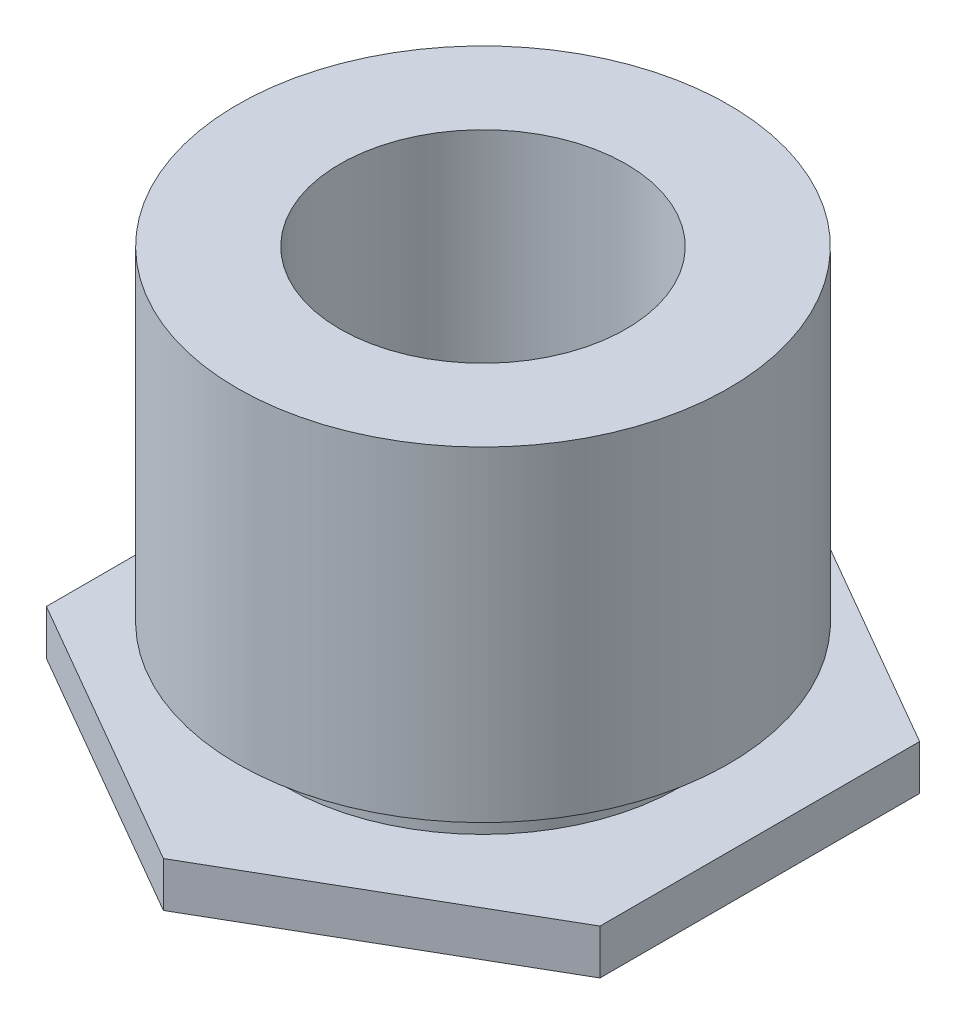
ISO-10303-21;
HEADER;
FILE_DESCRIPTION(('STEP AP214'),'2;1');
FILE_NAME('part.step','',(''),(''),'','','');
FILE_SCHEMA(('AUTOMOTIVE_DESIGN { 1 0 10303 214 1 1 1 1 }'));
ENDSEC;
DATA;
#1=APPLICATION_CONTEXT('core data for automotive mechanical design processes');
#2=APPLICATION_PROTOCOL_DEFINITION('international standard','automotive_design',2000,#1);
#3=PRODUCT_CONTEXT('',#1,'mechanical');
#4=PRODUCT('Part','Part','',(#3));
#5=PRODUCT_RELATED_PRODUCT_CATEGORY('part','',(#4));
#6=PRODUCT_DEFINITION_FORMATION('','',#4);
#7=PRODUCT_DEFINITION_CONTEXT('part definition',#1,'design');
#8=PRODUCT_DEFINITION('design','',#6,#7);
#9=PRODUCT_DEFINITION_SHAPE('','',#8);
#10=(LENGTH_UNIT() NAMED_UNIT(*) SI_UNIT(.MILLI.,.METRE.));
#11=(NAMED_UNIT(*) PLANE_ANGLE_UNIT() SI_UNIT($,.RADIAN.));
#12=(NAMED_UNIT(*) SI_UNIT($,.STERADIAN.) SOLID_ANGLE_UNIT());
#13=UNCERTAINTY_MEASURE_WITH_UNIT(LENGTH_MEASURE(1.E-05),#10,'distance_accuracy_value','');
#14=(GEOMETRIC_REPRESENTATION_CONTEXT(3) GLOBAL_UNCERTAINTY_ASSIGNED_CONTEXT((#13)) GLOBAL_UNIT_ASSIGNED_CONTEXT((#10,
#11,#12)) REPRESENTATION_CONTEXT('',''));
#15=CARTESIAN_POINT('',(0.,0.,0.));
#16=DIRECTION('',(0.,0.,1.));
#17=DIRECTION('',(1.,0.,0.));
#18=AXIS2_PLACEMENT_3D('',#15,#16,#17);
#19=CARTESIAN_POINT('',(-4.,0.65,2.3094010767585));
#20=DIRECTION('',(0.5,0.,-0.866025403784439));
#21=DIRECTION('',(-0.866025403784439,0.,-0.5));
#22=AXIS2_PLACEMENT_3D('',#19,#20,#21);
#23=PLANE('',#22);
#24=DIRECTION('',(0.866025403784438,0.,0.5));
#25=VECTOR('',#24,1.);
#26=CARTESIAN_POINT('',(-4.,0.,2.3094010767585));
#27=LINE('',#26,#25);
#28=CARTESIAN_POINT('',(-4.,0.,2.3094010767585));
#29=VERTEX_POINT('',#28);
#30=CARTESIAN_POINT('',(0.,0.,4.61880215351701));
#31=VERTEX_POINT('',#30);
#32=EDGE_CURVE('E122',#29,#31,#27,.T.);
#33=ORIENTED_EDGE('',*,*,#32,.T.);
#34=DIRECTION('',(0.,-1.,0.));
#35=VECTOR('',#34,1.);
#36=CARTESIAN_POINT('',(0.,0.65,4.61880215351701));
#37=LINE('',#36,#35);
#38=CARTESIAN_POINT('',(0.,0.65,4.61880215351701));
#39=VERTEX_POINT('',#38);
#40=EDGE_CURVE('E39',#39,#31,#37,.T.);
#41=ORIENTED_EDGE('',*,*,#40,.F.);
#42=DIRECTION('',(0.866025403784438,0.,0.5));
#43=VECTOR('',#42,1.);
#44=CARTESIAN_POINT('',(-4.,0.65,2.3094010767585));
#45=LINE('',#44,#43);
#46=CARTESIAN_POINT('',(-4.,0.65,2.3094010767585));
#47=VERTEX_POINT('',#46);
#48=EDGE_CURVE('E133',#47,#39,#45,.T.);
#49=ORIENTED_EDGE('',*,*,#48,.F.);
#50=DIRECTION('',(0.,-1.,0.));
#51=VECTOR('',#50,1.);
#52=CARTESIAN_POINT('',(-4.,0.65,2.3094010767585));
#53=LINE('',#52,#51);
#54=EDGE_CURVE('E118',#47,#29,#53,.T.);
#55=ORIENTED_EDGE('',*,*,#54,.T.);
#56=EDGE_LOOP('',(#33,#41,#49,#55));
#57=FACE_BOUND('',#56,.T.);
#58=ADVANCED_FACE('F36',(#57),#23,.F.);
#59=CARTESIAN_POINT('',(0.,0.65,4.61880215351701));
#60=DIRECTION('',(-0.5,0.,-0.866025403784439));
#61=DIRECTION('',(-0.866025403784439,0.,0.5));
#62=AXIS2_PLACEMENT_3D('',#59,#60,#61);
#63=PLANE('',#62);
#64=DIRECTION('',(0.866025403784439,0.,-0.5));
#65=VECTOR('',#64,1.);
#66=CARTESIAN_POINT('',(0.,0.,4.61880215351701));
#67=LINE('',#66,#65);
#68=CARTESIAN_POINT('',(4.,0.,2.3094010767585));
#69=VERTEX_POINT('',#68);
#70=EDGE_CURVE('E125',#31,#69,#67,.T.);
#71=ORIENTED_EDGE('',*,*,#70,.T.);
#72=DIRECTION('',(0.,-1.,0.));
#73=VECTOR('',#72,1.);
#74=CARTESIAN_POINT('',(4.,0.65,2.3094010767585));
#75=LINE('',#74,#73);
#76=CARTESIAN_POINT('',(4.,0.65,2.3094010767585));
#77=VERTEX_POINT('',#76);
#78=EDGE_CURVE('E136',#77,#69,#75,.T.);
#79=ORIENTED_EDGE('',*,*,#78,.F.);
#80=DIRECTION('',(0.866025403784439,0.,-0.5));
#81=VECTOR('',#80,1.);
#82=CARTESIAN_POINT('',(0.,0.65,4.61880215351701));
#83=LINE('',#82,#81);
#84=EDGE_CURVE('E91',#39,#77,#83,.T.);
#85=ORIENTED_EDGE('',*,*,#84,.F.);
#86=ORIENTED_EDGE('',*,*,#40,.T.);
#87=EDGE_LOOP('',(#71,#79,#85,#86));
#88=FACE_BOUND('',#87,.T.);
#89=ADVANCED_FACE('F141',(#88),#63,.F.);
#90=CARTESIAN_POINT('',(4.,0.65,2.3094010767585));
#91=DIRECTION('',(-1.,0.,0.));
#92=DIRECTION('',(0.,0.,1.));
#93=AXIS2_PLACEMENT_3D('',#90,#91,#92);
#94=PLANE('',#93);
#95=DIRECTION('',(0.,0.,-1.));
#96=VECTOR('',#95,1.);
#97=CARTESIAN_POINT('',(4.,0.,2.3094010767585));
#98=LINE('',#97,#96);
#99=CARTESIAN_POINT('',(4.,0.,-2.3094010767585));
#100=VERTEX_POINT('',#99);
#101=EDGE_CURVE('E128',#69,#100,#98,.T.);
#102=ORIENTED_EDGE('',*,*,#101,.T.);
#103=DIRECTION('',(0.,-1.,0.));
#104=VECTOR('',#103,1.);
#105=CARTESIAN_POINT('',(4.,0.65,-2.3094010767585));
#106=LINE('',#105,#104);
#107=CARTESIAN_POINT('',(4.,0.65,-2.3094010767585));
#108=VERTEX_POINT('',#107);
#109=EDGE_CURVE('E113',#108,#100,#106,.T.);
#110=ORIENTED_EDGE('',*,*,#109,.F.);
#111=DIRECTION('',(0.,0.,-1.));
#112=VECTOR('',#111,1.);
#113=CARTESIAN_POINT('',(4.,0.65,2.3094010767585));
#114=LINE('',#113,#112);
#115=EDGE_CURVE('E104',#77,#108,#114,.T.);
#116=ORIENTED_EDGE('',*,*,#115,.F.);
#117=ORIENTED_EDGE('',*,*,#78,.T.);
#118=EDGE_LOOP('',(#102,#110,#116,#117));
#119=FACE_BOUND('',#118,.T.);
#120=ADVANCED_FACE('F147',(#119),#94,.F.);
#121=CARTESIAN_POINT('',(4.,0.65,-2.3094010767585));
#122=DIRECTION('',(-0.5,0.,0.866025403784439));
#123=DIRECTION('',(0.866025403784439,0.,0.5));
#124=AXIS2_PLACEMENT_3D('',#121,#122,#123);
#125=PLANE('',#124);
#126=DIRECTION('',(-0.866025403784439,0.,-0.5));
#127=VECTOR('',#126,1.);
#128=CARTESIAN_POINT('',(4.,0.,-2.3094010767585));
#129=LINE('',#128,#127);
#130=CARTESIAN_POINT('',(0.,0.,-4.61880215351701));
#131=VERTEX_POINT('',#130);
#132=EDGE_CURVE('E112',#100,#131,#129,.T.);
#133=ORIENTED_EDGE('',*,*,#132,.T.);
#134=DIRECTION('',(0.,-1.,0.));
#135=VECTOR('',#134,1.);
#136=CARTESIAN_POINT('',(0.,0.65,-4.61880215351701));
#137=LINE('',#136,#135);
#138=CARTESIAN_POINT('',(0.,0.65,-4.61880215351701));
#139=VERTEX_POINT('',#138);
#140=EDGE_CURVE('E109',#139,#131,#137,.T.);
#141=ORIENTED_EDGE('',*,*,#140,.F.);
#142=DIRECTION('',(-0.866025403784439,0.,-0.5));
#143=VECTOR('',#142,1.);
#144=CARTESIAN_POINT('',(4.,0.65,-2.3094010767585));
#145=LINE('',#144,#143);
#146=EDGE_CURVE('E98',#108,#139,#145,.T.);
#147=ORIENTED_EDGE('',*,*,#146,.F.);
#148=ORIENTED_EDGE('',*,*,#109,.T.);
#149=EDGE_LOOP('',(#133,#141,#147,#148));
#150=FACE_BOUND('',#149,.T.);
#151=ADVANCED_FACE('F110',(#150),#125,.F.);
#152=CARTESIAN_POINT('',(0.,0.65,-4.61880215351701));
#153=DIRECTION('',(0.5,0.,0.866025403784439));
#154=DIRECTION('',(0.866025403784439,0.,-0.5));
#155=AXIS2_PLACEMENT_3D('',#152,#153,#154);
#156=PLANE('',#155);
#157=DIRECTION('',(-0.866025403784439,0.,0.5));
#158=VECTOR('',#157,1.);
#159=CARTESIAN_POINT('',(0.,0.,-4.61880215351701));
#160=LINE('',#159,#158);
#161=CARTESIAN_POINT('',(-4.,0.,-2.3094010767585));
#162=VERTEX_POINT('',#161);
#163=EDGE_CURVE('E76',#131,#162,#160,.T.);
#164=ORIENTED_EDGE('',*,*,#163,.T.);
#165=DIRECTION('',(0.,-1.,0.));
#166=VECTOR('',#165,1.);
#167=CARTESIAN_POINT('',(-4.,0.65,-2.3094010767585));
#168=LINE('',#167,#166);
#169=CARTESIAN_POINT('',(-4.,0.65,-2.3094010767585));
#170=VERTEX_POINT('',#169);
#171=EDGE_CURVE('E114',#170,#162,#168,.T.);
#172=ORIENTED_EDGE('',*,*,#171,.F.);
#173=DIRECTION('',(-0.866025403784439,0.,0.5));
#174=VECTOR('',#173,1.);
#175=CARTESIAN_POINT('',(0.,0.65,-4.61880215351701));
#176=LINE('',#175,#174);
#177=EDGE_CURVE('E102',#139,#170,#176,.T.);
#178=ORIENTED_EDGE('',*,*,#177,.F.);
#179=ORIENTED_EDGE('',*,*,#140,.T.);
#180=EDGE_LOOP('',(#164,#172,#178,#179));
#181=FACE_BOUND('',#180,.T.);
#182=ADVANCED_FACE('F116',(#181),#156,.F.);
#183=CARTESIAN_POINT('',(-4.,0.65,-2.3094010767585));
#184=DIRECTION('',(1.,0.,0.));
#185=DIRECTION('',(0.,0.,-1.));
#186=AXIS2_PLACEMENT_3D('',#183,#184,#185);
#187=PLANE('',#186);
#188=DIRECTION('',(0.,0.,1.));
#189=VECTOR('',#188,1.);
#190=CARTESIAN_POINT('',(-4.,0.,-2.3094010767585));
#191=LINE('',#190,#189);
#192=EDGE_CURVE('E82',#162,#29,#191,.T.);
#193=ORIENTED_EDGE('',*,*,#192,.T.);
#194=ORIENTED_EDGE('',*,*,#54,.F.);
#195=DIRECTION('',(0.,0.,1.));
#196=VECTOR('',#195,1.);
#197=CARTESIAN_POINT('',(-4.,0.65,-2.3094010767585));
#198=LINE('',#197,#196);
#199=EDGE_CURVE('E53',#170,#47,#198,.T.);
#200=ORIENTED_EDGE('',*,*,#199,.F.);
#201=ORIENTED_EDGE('',*,*,#171,.T.);
#202=EDGE_LOOP('',(#193,#194,#200,#201));
#203=FACE_BOUND('',#202,.T.);
#204=ADVANCED_FACE('F194',(#203),#187,.F.);
#205=CARTESIAN_POINT('',(0.,0.65,0.));
#206=DIRECTION('',(0.,1.,0.));
#207=DIRECTION('',(0.,0.,1.));
#208=AXIS2_PLACEMENT_3D('',#205,#206,#207);
#209=PLANE('',#208);
#210=CARTESIAN_POINT('',(0.,0.65,0.));
#211=DIRECTION('',(0.,1.,0.));
#212=DIRECTION('',(0.,0.,1.));
#213=AXIS2_PLACEMENT_3D('',#210,#211,#212);
#214=CIRCLE('',#213,2.84);
#215=CARTESIAN_POINT('',(0.,0.65,2.84));
#216=VERTEX_POINT('',#215);
#217=EDGE_CURVE('E11',#216,#216,#214,.T.);
#218=ORIENTED_EDGE('',*,*,#217,.F.);
#219=EDGE_LOOP('',(#218));
#220=FACE_BOUND('',#219,.T.);
#221=ORIENTED_EDGE('',*,*,#48,.T.);
#222=ORIENTED_EDGE('',*,*,#84,.T.);
#223=ORIENTED_EDGE('',*,*,#115,.T.);
#224=ORIENTED_EDGE('',*,*,#146,.T.);
#225=ORIENTED_EDGE('',*,*,#177,.T.);
#226=ORIENTED_EDGE('',*,*,#199,.T.);
#227=EDGE_LOOP('',(#221,#222,#223,#224,#225,#226));
#228=FACE_BOUND('',#227,.T.);
#229=ADVANCED_FACE('F100',(#220,#228),#209,.T.);
#230=CARTESIAN_POINT('',(0.,0.,0.));
#231=DIRECTION('',(0.,1.,0.));
#232=DIRECTION('',(0.,0.,1.));
#233=AXIS2_PLACEMENT_3D('',#230,#231,#232);
#234=PLANE('',#233);
#235=ORIENTED_EDGE('',*,*,#32,.F.);
#236=ORIENTED_EDGE('',*,*,#192,.F.);
#237=ORIENTED_EDGE('',*,*,#163,.F.);
#238=ORIENTED_EDGE('',*,*,#132,.F.);
#239=ORIENTED_EDGE('',*,*,#101,.F.);
#240=ORIENTED_EDGE('',*,*,#70,.F.);
#241=EDGE_LOOP('',(#235,#236,#237,#238,#239,#240));
#242=FACE_BOUND('',#241,.T.);
#243=ADVANCED_FACE('F146',(#242),#234,.F.);
#244=CARTESIAN_POINT('',(2.067,6.,0.));
#245=DIRECTION('',(0.,-1.,0.));
#246=DIRECTION('',(0.,0.,-1.));
#247=AXIS2_PLACEMENT_3D('',#244,#245,#246);
#248=PLANE('',#247);
#249=CARTESIAN_POINT('',(0.,6.,0.));
#250=DIRECTION('',(0.,1.,0.));
#251=DIRECTION('',(0.,0.,1.));
#252=AXIS2_PLACEMENT_3D('',#249,#250,#251);
#253=CIRCLE('',#252,2.067);
#254=CARTESIAN_POINT('',(0.,6.,2.067));
#255=VERTEX_POINT('',#254);
#256=EDGE_CURVE('E162',#255,#255,#253,.T.);
#257=ORIENTED_EDGE('',*,*,#256,.F.);
#258=EDGE_LOOP('',(#257));
#259=FACE_BOUND('',#258,.T.);
#260=CARTESIAN_POINT('',(0.,6.,0.));
#261=DIRECTION('',(0.,1.,0.));
#262=DIRECTION('',(0.,0.,1.));
#263=AXIS2_PLACEMENT_3D('',#260,#261,#262);
#264=CIRCLE('',#263,3.55);
#265=CARTESIAN_POINT('',(0.,6.,3.55));
#266=VERTEX_POINT('',#265);
#267=EDGE_CURVE('E126',#266,#266,#264,.T.);
#268=ORIENTED_EDGE('',*,*,#267,.T.);
#269=EDGE_LOOP('',(#268));
#270=FACE_BOUND('',#269,.T.);
#271=ADVANCED_FACE('F168',(#259,#270),#248,.F.);
#272=CARTESIAN_POINT('',(0.,2.8,0.));
#273=DIRECTION('',(0.,1.,0.));
#274=DIRECTION('',(0.,0.,1.));
#275=AXIS2_PLACEMENT_3D('',#272,#273,#274);
#276=CYLINDRICAL_SURFACE('',#275,3.55);
#277=ORIENTED_EDGE('',*,*,#267,.F.);
#278=EDGE_LOOP('',(#277));
#279=FACE_BOUND('',#278,.T.);
#280=CARTESIAN_POINT('',(0.,1.3,0.));
#281=DIRECTION('',(0.,1.,0.));
#282=DIRECTION('',(0.,0.,1.));
#283=AXIS2_PLACEMENT_3D('',#280,#281,#282);
#284=CIRCLE('',#283,3.55);
#285=CARTESIAN_POINT('',(0.,1.3,3.55));
#286=VERTEX_POINT('',#285);
#287=EDGE_CURVE('E153',#286,#286,#284,.T.);
#288=ORIENTED_EDGE('',*,*,#287,.T.);
#289=EDGE_LOOP('',(#288));
#290=FACE_BOUND('',#289,.T.);
#291=ADVANCED_FACE('F171',(#279,#290),#276,.T.);
#292=CARTESIAN_POINT('',(3.55,1.3,0.));
#293=DIRECTION('',(0.,1.,0.));
#294=DIRECTION('',(0.,0.,1.));
#295=AXIS2_PLACEMENT_3D('',#292,#293,#294);
#296=PLANE('',#295);
#297=ORIENTED_EDGE('',*,*,#287,.F.);
#298=EDGE_LOOP('',(#297));
#299=FACE_BOUND('',#298,.T.);
#300=CARTESIAN_POINT('',(0.,1.3,0.));
#301=DIRECTION('',(0.,1.,0.));
#302=DIRECTION('',(0.,0.,1.));
#303=AXIS2_PLACEMENT_3D('',#300,#301,#302);
#304=CIRCLE('',#303,2.84);
#305=CARTESIAN_POINT('',(0.,1.3,2.84));
#306=VERTEX_POINT('',#305);
#307=EDGE_CURVE('E156',#306,#306,#304,.T.);
#308=ORIENTED_EDGE('',*,*,#307,.T.);
#309=EDGE_LOOP('',(#308));
#310=FACE_BOUND('',#309,.T.);
#311=ADVANCED_FACE('F177',(#299,#310),#296,.F.);
#312=CARTESIAN_POINT('',(0.,2.8,0.));
#313=DIRECTION('',(0.,1.,0.));
#314=DIRECTION('',(0.,0.,1.));
#315=AXIS2_PLACEMENT_3D('',#312,#313,#314);
#316=CYLINDRICAL_SURFACE('',#315,2.84);
#317=ORIENTED_EDGE('',*,*,#307,.F.);
#318=EDGE_LOOP('',(#317));
#319=FACE_BOUND('',#318,.T.);
#320=ORIENTED_EDGE('',*,*,#217,.T.);
#321=EDGE_LOOP('',(#320));
#322=FACE_BOUND('',#321,.T.);
#323=ADVANCED_FACE('F183',(#319,#322),#316,.T.);
#324=CARTESIAN_POINT('',(0.,2.8,0.));
#325=DIRECTION('',(0.,-1.,0.));
#326=DIRECTION('',(0.,0.,-1.));
#327=AXIS2_PLACEMENT_3D('',#324,#325,#326);
#328=PLANE('',#327);
#329=CARTESIAN_POINT('',(0.,2.8,0.));
#330=DIRECTION('',(0.,1.,0.));
#331=DIRECTION('',(0.,0.,1.));
#332=AXIS2_PLACEMENT_3D('',#329,#330,#331);
#333=CIRCLE('',#332,2.067);
#334=CARTESIAN_POINT('',(0.,2.8,2.067));
#335=VERTEX_POINT('',#334);
#336=EDGE_CURVE('E158',#335,#335,#333,.T.);
#337=ORIENTED_EDGE('',*,*,#336,.T.);
#338=EDGE_LOOP('',(#337));
#339=FACE_BOUND('',#338,.T.);
#340=ADVANCED_FACE('F189',(#339),#328,.F.);
#341=CARTESIAN_POINT('',(0.,2.8,0.));
#342=DIRECTION('',(0.,1.,0.));
#343=DIRECTION('',(0.,0.,1.));
#344=AXIS2_PLACEMENT_3D('',#341,#342,#343);
#345=CYLINDRICAL_SURFACE('',#344,2.067);
#346=ORIENTED_EDGE('',*,*,#336,.F.);
#347=EDGE_LOOP('',(#346));
#348=FACE_BOUND('',#347,.T.);
#349=ORIENTED_EDGE('',*,*,#256,.T.);
#350=EDGE_LOOP('',(#349));
#351=FACE_BOUND('',#350,.T.);
#352=ADVANCED_FACE('F166',(#348,#351),#345,.F.);
#353=CLOSED_SHELL('',(#58,#89,#120,#151,#182,#204,#229,#243,#271,#291,#311,#323,#340,#352));
#354=MANIFOLD_SOLID_BREP('B2',#353);
#355=ADVANCED_BREP_SHAPE_REPRESENTATION('',(#18,#354),#14);
#356=SHAPE_DEFINITION_REPRESENTATION(#9,#355);
ENDSEC;
END-ISO-10303-21;
